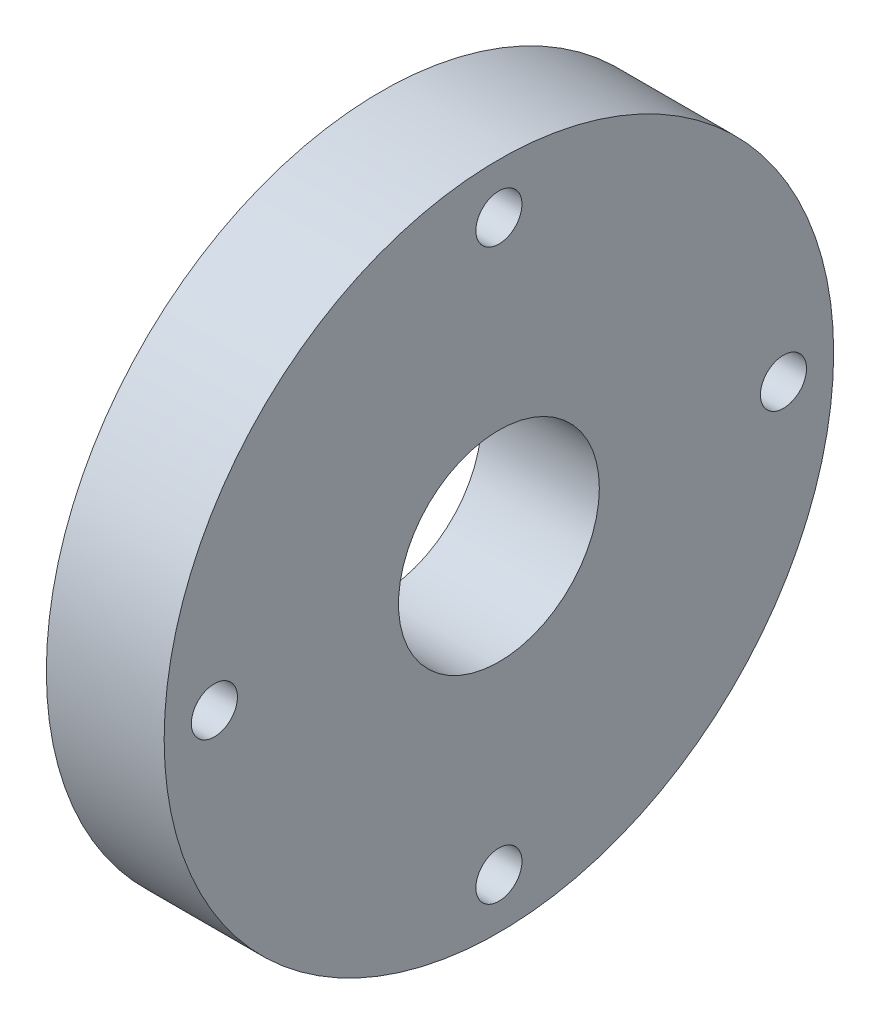
ISO-10303-21;
HEADER;
FILE_DESCRIPTION(('STEP AP214'),'2;1');
FILE_NAME('part.step','',(''),(''),'','','');
FILE_SCHEMA(('AUTOMOTIVE_DESIGN { 1 0 10303 214 1 1 1 1 }'));
ENDSEC;
DATA;
#1=APPLICATION_CONTEXT('core data for automotive mechanical design processes');
#2=APPLICATION_PROTOCOL_DEFINITION('international standard','automotive_design',2000,#1);
#3=PRODUCT_CONTEXT('',#1,'mechanical');
#4=PRODUCT('Part','Part','',(#3));
#5=PRODUCT_RELATED_PRODUCT_CATEGORY('part','',(#4));
#6=PRODUCT_DEFINITION_FORMATION('','',#4);
#7=PRODUCT_DEFINITION_CONTEXT('part definition',#1,'design');
#8=PRODUCT_DEFINITION('design','',#6,#7);
#9=PRODUCT_DEFINITION_SHAPE('','',#8);
#10=(LENGTH_UNIT() NAMED_UNIT(*) SI_UNIT(.MILLI.,.METRE.));
#11=(NAMED_UNIT(*) PLANE_ANGLE_UNIT() SI_UNIT($,.RADIAN.));
#12=(NAMED_UNIT(*) SI_UNIT($,.STERADIAN.) SOLID_ANGLE_UNIT());
#13=UNCERTAINTY_MEASURE_WITH_UNIT(LENGTH_MEASURE(1.E-05),#10,'distance_accuracy_value','');
#14=(GEOMETRIC_REPRESENTATION_CONTEXT(3) GLOBAL_UNCERTAINTY_ASSIGNED_CONTEXT((#13)) GLOBAL_UNIT_ASSIGNED_CONTEXT((#10,
#11,#12)) REPRESENTATION_CONTEXT('',''));
#15=CARTESIAN_POINT('',(0.,0.,0.));
#16=DIRECTION('',(0.,0.,1.));
#17=DIRECTION('',(1.,0.,0.));
#18=AXIS2_PLACEMENT_3D('',#15,#16,#17);
#19=CARTESIAN_POINT('',(22.352,0.,0.));
#20=DIRECTION('',(-1.,0.,0.));
#21=DIRECTION('',(0.,0.,1.));
#22=AXIS2_PLACEMENT_3D('',#19,#20,#21);
#23=CYLINDRICAL_SURFACE('',#22,63.5);
#24=CARTESIAN_POINT('',(22.352,0.,0.));
#25=DIRECTION('',(1.,0.,0.));
#26=DIRECTION('',(0.,0.,-1.));
#27=AXIS2_PLACEMENT_3D('',#24,#25,#26);
#28=CIRCLE('',#27,63.5);
#29=CARTESIAN_POINT('',(22.352,0.,-63.5));
#30=VERTEX_POINT('',#29);
#31=EDGE_CURVE('E10',#30,#30,#28,.T.);
#32=ORIENTED_EDGE('',*,*,#31,.F.);
#33=EDGE_LOOP('',(#32));
#34=FACE_BOUND('',#33,.T.);
#35=CARTESIAN_POINT('',(0.,0.,0.));
#36=DIRECTION('',(1.,0.,0.));
#37=DIRECTION('',(0.,0.,-1.));
#38=AXIS2_PLACEMENT_3D('',#35,#36,#37);
#39=CIRCLE('',#38,63.5);
#40=CARTESIAN_POINT('',(0.,0.,-63.5));
#41=VERTEX_POINT('',#40);
#42=EDGE_CURVE('E44',#41,#41,#39,.T.);
#43=ORIENTED_EDGE('',*,*,#42,.T.);
#44=EDGE_LOOP('',(#43));
#45=FACE_BOUND('',#44,.T.);
#46=ADVANCED_FACE('F37',(#34,#45),#23,.T.);
#47=CARTESIAN_POINT('',(22.352,0.,0.));
#48=DIRECTION('',(1.,0.,0.));
#49=DIRECTION('',(0.,0.,-1.));
#50=AXIS2_PLACEMENT_3D('',#47,#48,#49);
#51=PLANE('',#50);
#52=CARTESIAN_POINT('',(22.352,53.975,0.));
#53=DIRECTION('',(1.,0.,0.));
#54=DIRECTION('',(0.,0.,-1.));
#55=AXIS2_PLACEMENT_3D('',#52,#53,#54);
#56=CIRCLE('',#55,4.3688);
#57=CARTESIAN_POINT('',(22.352,53.975,-4.3688));
#58=VERTEX_POINT('',#57);
#59=EDGE_CURVE('E82',#58,#58,#56,.T.);
#60=ORIENTED_EDGE('',*,*,#59,.F.);
#61=EDGE_LOOP('',(#60));
#62=FACE_BOUND('',#61,.T.);
#63=CARTESIAN_POINT('',(22.352,0.,53.975));
#64=DIRECTION('',(1.,0.,0.));
#65=DIRECTION('',(0.,0.,-1.));
#66=AXIS2_PLACEMENT_3D('',#63,#64,#65);
#67=CIRCLE('',#66,4.3688);
#68=CARTESIAN_POINT('',(22.352,0.,49.6062));
#69=VERTEX_POINT('',#68);
#70=EDGE_CURVE('E75',#69,#69,#67,.T.);
#71=ORIENTED_EDGE('',*,*,#70,.F.);
#72=EDGE_LOOP('',(#71));
#73=FACE_BOUND('',#72,.T.);
#74=CARTESIAN_POINT('',(22.352,-53.975,0.));
#75=DIRECTION('',(1.,0.,0.));
#76=DIRECTION('',(0.,0.,-1.));
#77=AXIS2_PLACEMENT_3D('',#74,#75,#76);
#78=CIRCLE('',#77,4.3688);
#79=CARTESIAN_POINT('',(22.352,-53.975,-4.3688));
#80=VERTEX_POINT('',#79);
#81=EDGE_CURVE('E70',#80,#80,#78,.T.);
#82=ORIENTED_EDGE('',*,*,#81,.F.);
#83=EDGE_LOOP('',(#82));
#84=FACE_BOUND('',#83,.T.);
#85=CARTESIAN_POINT('',(22.352,0.,-53.975));
#86=DIRECTION('',(1.,0.,0.));
#87=DIRECTION('',(0.,0.,-1.));
#88=AXIS2_PLACEMENT_3D('',#85,#86,#87);
#89=CIRCLE('',#88,4.36879999999999);
#90=CARTESIAN_POINT('',(22.352,0.,-58.3438));
#91=VERTEX_POINT('',#90);
#92=EDGE_CURVE('E66',#91,#91,#89,.T.);
#93=ORIENTED_EDGE('',*,*,#92,.F.);
#94=EDGE_LOOP('',(#93));
#95=FACE_BOUND('',#94,.T.);
#96=CARTESIAN_POINT('',(22.352,0.,0.));
#97=DIRECTION('',(1.,0.,0.));
#98=DIRECTION('',(0.,0.,-1.));
#99=AXIS2_PLACEMENT_3D('',#96,#97,#98);
#100=CIRCLE('',#99,19.05);
#101=CARTESIAN_POINT('',(22.352,0.,-19.05));
#102=VERTEX_POINT('',#101);
#103=EDGE_CURVE('E49',#102,#102,#100,.T.);
#104=ORIENTED_EDGE('',*,*,#103,.F.);
#105=EDGE_LOOP('',(#104));
#106=FACE_BOUND('',#105,.T.);
#107=ORIENTED_EDGE('',*,*,#31,.T.);
#108=EDGE_LOOP('',(#107));
#109=FACE_BOUND('',#108,.T.);
#110=ADVANCED_FACE('F133',(#62,#73,#84,#95,#106,#109),#51,.T.);
#111=CARTESIAN_POINT('',(0.,0.,0.));
#112=DIRECTION('',(1.,0.,0.));
#113=DIRECTION('',(0.,0.,-1.));
#114=AXIS2_PLACEMENT_3D('',#111,#112,#113);
#115=PLANE('',#114);
#116=CARTESIAN_POINT('',(0.,53.975,0.));
#117=DIRECTION('',(1.,0.,0.));
#118=DIRECTION('',(0.,0.,-1.));
#119=AXIS2_PLACEMENT_3D('',#116,#117,#118);
#120=CIRCLE('',#119,6.7437);
#121=CARTESIAN_POINT('',(0.,53.975,-6.7437));
#122=VERTEX_POINT('',#121);
#123=EDGE_CURVE('E109',#122,#122,#120,.T.);
#124=ORIENTED_EDGE('',*,*,#123,.T.);
#125=EDGE_LOOP('',(#124));
#126=FACE_BOUND('',#125,.T.);
#127=CARTESIAN_POINT('',(0.,0.,53.975));
#128=DIRECTION('',(1.,0.,0.));
#129=DIRECTION('',(0.,0.,-1.));
#130=AXIS2_PLACEMENT_3D('',#127,#128,#129);
#131=CIRCLE('',#130,6.7437);
#132=CARTESIAN_POINT('',(0.,0.,47.2313));
#133=VERTEX_POINT('',#132);
#134=EDGE_CURVE('E106',#133,#133,#131,.T.);
#135=ORIENTED_EDGE('',*,*,#134,.T.);
#136=EDGE_LOOP('',(#135));
#137=FACE_BOUND('',#136,.T.);
#138=CARTESIAN_POINT('',(0.,-53.975,0.));
#139=DIRECTION('',(1.,0.,0.));
#140=DIRECTION('',(0.,0.,-1.));
#141=AXIS2_PLACEMENT_3D('',#138,#139,#140);
#142=CIRCLE('',#141,6.7437);
#143=CARTESIAN_POINT('',(0.,-53.975,-6.7437));
#144=VERTEX_POINT('',#143);
#145=EDGE_CURVE('E100',#144,#144,#142,.T.);
#146=ORIENTED_EDGE('',*,*,#145,.T.);
#147=EDGE_LOOP('',(#146));
#148=FACE_BOUND('',#147,.T.);
#149=CARTESIAN_POINT('',(0.,0.,-53.975));
#150=DIRECTION('',(1.,0.,0.));
#151=DIRECTION('',(0.,0.,-1.));
#152=AXIS2_PLACEMENT_3D('',#149,#150,#151);
#153=CIRCLE('',#152,6.74369999999999);
#154=CARTESIAN_POINT('',(0.,0.,-60.7187));
#155=VERTEX_POINT('',#154);
#156=EDGE_CURVE('E94',#155,#155,#153,.T.);
#157=ORIENTED_EDGE('',*,*,#156,.T.);
#158=EDGE_LOOP('',(#157));
#159=FACE_BOUND('',#158,.T.);
#160=CARTESIAN_POINT('',(0.,0.,0.));
#161=DIRECTION('',(1.,0.,0.));
#162=DIRECTION('',(0.,0.,-1.));
#163=AXIS2_PLACEMENT_3D('',#160,#161,#162);
#164=CIRCLE('',#163,19.05);
#165=CARTESIAN_POINT('',(0.,0.,-19.05));
#166=VERTEX_POINT('',#165);
#167=EDGE_CURVE('E52',#166,#166,#164,.T.);
#168=ORIENTED_EDGE('',*,*,#167,.T.);
#169=EDGE_LOOP('',(#168));
#170=FACE_BOUND('',#169,.T.);
#171=ORIENTED_EDGE('',*,*,#42,.F.);
#172=EDGE_LOOP('',(#171));
#173=FACE_BOUND('',#172,.T.);
#174=ADVANCED_FACE('F139',(#126,#137,#148,#159,#170,#173),#115,.F.);
#175=CARTESIAN_POINT('',(22.352,0.,0.));
#176=DIRECTION('',(-1.,0.,0.));
#177=DIRECTION('',(0.,0.,1.));
#178=AXIS2_PLACEMENT_3D('',#175,#176,#177);
#179=CYLINDRICAL_SURFACE('',#178,19.05);
#180=ORIENTED_EDGE('',*,*,#103,.T.);
#181=EDGE_LOOP('',(#180));
#182=FACE_BOUND('',#181,.T.);
#183=ORIENTED_EDGE('',*,*,#167,.F.);
#184=EDGE_LOOP('',(#183));
#185=FACE_BOUND('',#184,.T.);
#186=ADVANCED_FACE('F146',(#182,#185),#179,.F.);
#187=CARTESIAN_POINT('',(22.352,0.,-53.975));
#188=DIRECTION('',(-1.,0.,0.));
#189=DIRECTION('',(0.,0.,1.));
#190=AXIS2_PLACEMENT_3D('',#187,#188,#189);
#191=CYLINDRICAL_SURFACE('',#190,4.36879999999999);
#192=CARTESIAN_POINT('',(9.652,0.,-53.975));
#193=DIRECTION('',(1.,0.,0.));
#194=DIRECTION('',(0.,0.,-1.));
#195=AXIS2_PLACEMENT_3D('',#192,#193,#194);
#196=CIRCLE('',#195,4.36879999999999);
#197=CARTESIAN_POINT('',(9.652,0.,-58.3438));
#198=VERTEX_POINT('',#197);
#199=EDGE_CURVE('E40',#198,#198,#196,.T.);
#200=ORIENTED_EDGE('',*,*,#199,.F.);
#201=EDGE_LOOP('',(#200));
#202=FACE_BOUND('',#201,.T.);
#203=ORIENTED_EDGE('',*,*,#92,.T.);
#204=EDGE_LOOP('',(#203));
#205=FACE_BOUND('',#204,.T.);
#206=ADVANCED_FACE('F151',(#202,#205),#191,.F.);
#207=CARTESIAN_POINT('',(22.352,-53.975,0.));
#208=DIRECTION('',(-1.,0.,0.));
#209=DIRECTION('',(0.,0.,1.));
#210=AXIS2_PLACEMENT_3D('',#207,#208,#209);
#211=CYLINDRICAL_SURFACE('',#210,4.3688);
#212=CARTESIAN_POINT('',(9.652,-53.975,0.));
#213=DIRECTION('',(1.,0.,0.));
#214=DIRECTION('',(0.,0.,-1.));
#215=AXIS2_PLACEMENT_3D('',#212,#213,#214);
#216=CIRCLE('',#215,4.3688);
#217=CARTESIAN_POINT('',(9.652,-53.975,-4.3688));
#218=VERTEX_POINT('',#217);
#219=EDGE_CURVE('E61',#218,#218,#216,.T.);
#220=ORIENTED_EDGE('',*,*,#219,.F.);
#221=EDGE_LOOP('',(#220));
#222=FACE_BOUND('',#221,.T.);
#223=ORIENTED_EDGE('',*,*,#81,.T.);
#224=EDGE_LOOP('',(#223));
#225=FACE_BOUND('',#224,.T.);
#226=ADVANCED_FACE('F156',(#222,#225),#211,.F.);
#227=CARTESIAN_POINT('',(22.352,0.,53.975));
#228=DIRECTION('',(-1.,0.,0.));
#229=DIRECTION('',(0.,0.,1.));
#230=AXIS2_PLACEMENT_3D('',#227,#228,#229);
#231=CYLINDRICAL_SURFACE('',#230,4.3688);
#232=CARTESIAN_POINT('',(9.652,0.,53.975));
#233=DIRECTION('',(1.,0.,0.));
#234=DIRECTION('',(0.,0.,-1.));
#235=AXIS2_PLACEMENT_3D('',#232,#233,#234);
#236=CIRCLE('',#235,4.3688);
#237=CARTESIAN_POINT('',(9.652,0.,49.6062));
#238=VERTEX_POINT('',#237);
#239=EDGE_CURVE('E58',#238,#238,#236,.T.);
#240=ORIENTED_EDGE('',*,*,#239,.F.);
#241=EDGE_LOOP('',(#240));
#242=FACE_BOUND('',#241,.T.);
#243=ORIENTED_EDGE('',*,*,#70,.T.);
#244=EDGE_LOOP('',(#243));
#245=FACE_BOUND('',#244,.T.);
#246=ADVANCED_FACE('F160',(#242,#245),#231,.F.);
#247=CARTESIAN_POINT('',(22.352,53.975,0.));
#248=DIRECTION('',(-1.,0.,0.));
#249=DIRECTION('',(0.,0.,1.));
#250=AXIS2_PLACEMENT_3D('',#247,#248,#249);
#251=CYLINDRICAL_SURFACE('',#250,4.3688);
#252=CARTESIAN_POINT('',(9.652,53.975,0.));
#253=DIRECTION('',(1.,0.,0.));
#254=DIRECTION('',(0.,0.,-1.));
#255=AXIS2_PLACEMENT_3D('',#252,#253,#254);
#256=CIRCLE('',#255,4.3688);
#257=CARTESIAN_POINT('',(9.652,53.975,-4.3688));
#258=VERTEX_POINT('',#257);
#259=EDGE_CURVE('E55',#258,#258,#256,.T.);
#260=ORIENTED_EDGE('',*,*,#259,.F.);
#261=EDGE_LOOP('',(#260));
#262=FACE_BOUND('',#261,.T.);
#263=ORIENTED_EDGE('',*,*,#59,.T.);
#264=EDGE_LOOP('',(#263));
#265=FACE_BOUND('',#264,.T.);
#266=ADVANCED_FACE('F130',(#262,#265),#251,.F.);
#267=CARTESIAN_POINT('',(9.652,53.975,0.));
#268=DIRECTION('',(-1.,0.,0.));
#269=DIRECTION('',(0.,0.,1.));
#270=AXIS2_PLACEMENT_3D('',#267,#268,#269);
#271=CYLINDRICAL_SURFACE('',#270,6.7437);
#272=CARTESIAN_POINT('',(9.652,53.975,0.));
#273=DIRECTION('',(1.,0.,0.));
#274=DIRECTION('',(0.,0.,-1.));
#275=AXIS2_PLACEMENT_3D('',#272,#273,#274);
#276=CIRCLE('',#275,6.7437);
#277=CARTESIAN_POINT('',(9.652,53.975,-6.7437));
#278=VERTEX_POINT('',#277);
#279=EDGE_CURVE('E59',#278,#278,#276,.T.);
#280=ORIENTED_EDGE('',*,*,#279,.T.);
#281=EDGE_LOOP('',(#280));
#282=FACE_BOUND('',#281,.T.);
#283=ORIENTED_EDGE('',*,*,#123,.F.);
#284=EDGE_LOOP('',(#283));
#285=FACE_BOUND('',#284,.T.);
#286=ADVANCED_FACE('F115',(#282,#285),#271,.F.);
#287=CARTESIAN_POINT('',(9.652,53.975,0.));
#288=DIRECTION('',(1.,0.,0.));
#289=DIRECTION('',(0.,0.,-1.));
#290=AXIS2_PLACEMENT_3D('',#287,#288,#289);
#291=PLANE('',#290);
#292=ORIENTED_EDGE('',*,*,#259,.T.);
#293=EDGE_LOOP('',(#292));
#294=FACE_BOUND('',#293,.T.);
#295=ORIENTED_EDGE('',*,*,#279,.F.);
#296=EDGE_LOOP('',(#295));
#297=FACE_BOUND('',#296,.T.);
#298=ADVANCED_FACE('F118',(#294,#297),#291,.F.);
#299=CARTESIAN_POINT('',(9.652,0.,53.975));
#300=DIRECTION('',(-1.,0.,0.));
#301=DIRECTION('',(0.,0.,1.));
#302=AXIS2_PLACEMENT_3D('',#299,#300,#301);
#303=CYLINDRICAL_SURFACE('',#302,6.7437);
#304=CARTESIAN_POINT('',(9.652,0.,53.975));
#305=DIRECTION('',(1.,0.,0.));
#306=DIRECTION('',(0.,0.,-1.));
#307=AXIS2_PLACEMENT_3D('',#304,#305,#306);
#308=CIRCLE('',#307,6.7437);
#309=CARTESIAN_POINT('',(9.652,0.,47.2313));
#310=VERTEX_POINT('',#309);
#311=EDGE_CURVE('E103',#310,#310,#308,.T.);
#312=ORIENTED_EDGE('',*,*,#311,.T.);
#313=EDGE_LOOP('',(#312));
#314=FACE_BOUND('',#313,.T.);
#315=ORIENTED_EDGE('',*,*,#134,.F.);
#316=EDGE_LOOP('',(#315));
#317=FACE_BOUND('',#316,.T.);
#318=ADVANCED_FACE('F120',(#314,#317),#303,.F.);
#319=CARTESIAN_POINT('',(9.652,0.,53.975));
#320=DIRECTION('',(1.,0.,0.));
#321=DIRECTION('',(0.,0.,-1.));
#322=AXIS2_PLACEMENT_3D('',#319,#320,#321);
#323=PLANE('',#322);
#324=ORIENTED_EDGE('',*,*,#239,.T.);
#325=EDGE_LOOP('',(#324));
#326=FACE_BOUND('',#325,.T.);
#327=ORIENTED_EDGE('',*,*,#311,.F.);
#328=EDGE_LOOP('',(#327));
#329=FACE_BOUND('',#328,.T.);
#330=ADVANCED_FACE('F127',(#326,#329),#323,.F.);
#331=CARTESIAN_POINT('',(9.652,-53.975,0.));
#332=DIRECTION('',(-1.,0.,0.));
#333=DIRECTION('',(0.,0.,1.));
#334=AXIS2_PLACEMENT_3D('',#331,#332,#333);
#335=CYLINDRICAL_SURFACE('',#334,6.7437);
#336=CARTESIAN_POINT('',(9.652,-53.975,0.));
#337=DIRECTION('',(1.,0.,0.));
#338=DIRECTION('',(0.,0.,-1.));
#339=AXIS2_PLACEMENT_3D('',#336,#337,#338);
#340=CIRCLE('',#339,6.7437);
#341=CARTESIAN_POINT('',(9.652,-53.975,-6.7437));
#342=VERTEX_POINT('',#341);
#343=EDGE_CURVE('E97',#342,#342,#340,.T.);
#344=ORIENTED_EDGE('',*,*,#343,.T.);
#345=EDGE_LOOP('',(#344));
#346=FACE_BOUND('',#345,.T.);
#347=ORIENTED_EDGE('',*,*,#145,.F.);
#348=EDGE_LOOP('',(#347));
#349=FACE_BOUND('',#348,.T.);
#350=ADVANCED_FACE('F178',(#346,#349),#335,.F.);
#351=CARTESIAN_POINT('',(9.652,-53.975,0.));
#352=DIRECTION('',(1.,0.,0.));
#353=DIRECTION('',(0.,0.,-1.));
#354=AXIS2_PLACEMENT_3D('',#351,#352,#353);
#355=PLANE('',#354);
#356=ORIENTED_EDGE('',*,*,#219,.T.);
#357=EDGE_LOOP('',(#356));
#358=FACE_BOUND('',#357,.T.);
#359=ORIENTED_EDGE('',*,*,#343,.F.);
#360=EDGE_LOOP('',(#359));
#361=FACE_BOUND('',#360,.T.);
#362=ADVANCED_FACE('F174',(#358,#361),#355,.F.);
#363=CARTESIAN_POINT('',(9.652,0.,-53.975));
#364=DIRECTION('',(-1.,0.,0.));
#365=DIRECTION('',(0.,0.,1.));
#366=AXIS2_PLACEMENT_3D('',#363,#364,#365);
#367=CYLINDRICAL_SURFACE('',#366,6.74369999999999);
#368=CARTESIAN_POINT('',(9.652,0.,-53.975));
#369=DIRECTION('',(1.,0.,0.));
#370=DIRECTION('',(0.,0.,-1.));
#371=AXIS2_PLACEMENT_3D('',#368,#369,#370);
#372=CIRCLE('',#371,6.74369999999999);
#373=CARTESIAN_POINT('',(9.652,0.,-60.7187));
#374=VERTEX_POINT('',#373);
#375=EDGE_CURVE('E91',#374,#374,#372,.T.);
#376=ORIENTED_EDGE('',*,*,#375,.T.);
#377=EDGE_LOOP('',(#376));
#378=FACE_BOUND('',#377,.T.);
#379=ORIENTED_EDGE('',*,*,#156,.F.);
#380=EDGE_LOOP('',(#379));
#381=FACE_BOUND('',#380,.T.);
#382=ADVANCED_FACE('F171',(#378,#381),#367,.F.);
#383=CARTESIAN_POINT('',(9.652,0.,-53.975));
#384=DIRECTION('',(1.,0.,0.));
#385=DIRECTION('',(0.,0.,-1.));
#386=AXIS2_PLACEMENT_3D('',#383,#384,#385);
#387=PLANE('',#386);
#388=ORIENTED_EDGE('',*,*,#199,.T.);
#389=EDGE_LOOP('',(#388));
#390=FACE_BOUND('',#389,.T.);
#391=ORIENTED_EDGE('',*,*,#375,.F.);
#392=EDGE_LOOP('',(#391));
#393=FACE_BOUND('',#392,.T.);
#394=ADVANCED_FACE('F168',(#390,#393),#387,.F.);
#395=CLOSED_SHELL('',(#46,#110,#174,#186,#206,#226,#246,#266,#286,#298,#318,#330,#350,#362,#382,#394));
#396=MANIFOLD_SOLID_BREP('B2',#395);
#397=ADVANCED_BREP_SHAPE_REPRESENTATION('',(#18,#396),#14);
#398=SHAPE_DEFINITION_REPRESENTATION(#9,#397);
ENDSEC;
END-ISO-10303-21;
